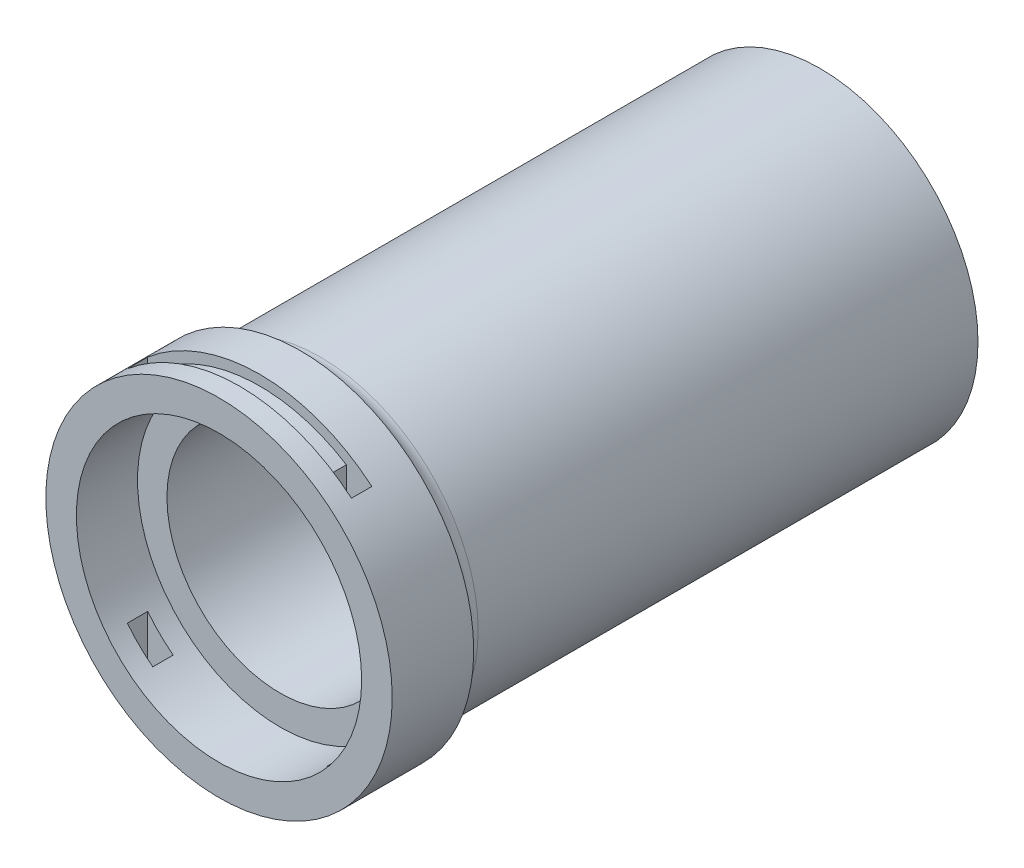
ISO-10303-21;
HEADER;
FILE_DESCRIPTION(('STEP AP214'),'2;1');
FILE_NAME('part.step','',(''),(''),'','','');
FILE_SCHEMA(('AUTOMOTIVE_DESIGN { 1 0 10303 214 1 1 1 1 }'));
ENDSEC;
DATA;
#1=APPLICATION_CONTEXT('core data for automotive mechanical design processes');
#2=APPLICATION_PROTOCOL_DEFINITION('international standard','automotive_design',2000,#1);
#3=PRODUCT_CONTEXT('',#1,'mechanical');
#4=PRODUCT('Part','Part','',(#3));
#5=PRODUCT_RELATED_PRODUCT_CATEGORY('part','',(#4));
#6=PRODUCT_DEFINITION_FORMATION('','',#4);
#7=PRODUCT_DEFINITION_CONTEXT('part definition',#1,'design');
#8=PRODUCT_DEFINITION('design','',#6,#7);
#9=PRODUCT_DEFINITION_SHAPE('','',#8);
#10=(LENGTH_UNIT() NAMED_UNIT(*) SI_UNIT(.MILLI.,.METRE.));
#11=(NAMED_UNIT(*) PLANE_ANGLE_UNIT() SI_UNIT($,.RADIAN.));
#12=(NAMED_UNIT(*) SI_UNIT($,.STERADIAN.) SOLID_ANGLE_UNIT());
#13=UNCERTAINTY_MEASURE_WITH_UNIT(LENGTH_MEASURE(1.E-05),#10,'distance_accuracy_value','');
#14=(GEOMETRIC_REPRESENTATION_CONTEXT(3) GLOBAL_UNCERTAINTY_ASSIGNED_CONTEXT((#13)) GLOBAL_UNIT_ASSIGNED_CONTEXT((#10,
#11,#12)) REPRESENTATION_CONTEXT('',''));
#15=CARTESIAN_POINT('',(0.,0.,0.));
#16=DIRECTION('',(0.,0.,1.));
#17=DIRECTION('',(1.,0.,0.));
#18=AXIS2_PLACEMENT_3D('',#15,#16,#17);
#19=CARTESIAN_POINT('',(0.,0.,0.));
#20=DIRECTION('',(0.,0.,1.));
#21=DIRECTION('',(1.,0.,0.));
#22=AXIS2_PLACEMENT_3D('',#19,#20,#21);
#23=CYLINDRICAL_SURFACE('',#22,5.625);
#24=CARTESIAN_POINT('',(0.,0.,-33.));
#25=DIRECTION('',(0.,0.,-1.));
#26=DIRECTION('',(-1.,0.,0.));
#27=AXIS2_PLACEMENT_3D('',#24,#25,#26);
#28=CIRCLE('',#27,5.625);
#29=CARTESIAN_POINT('',(-5.625,0.,-33.));
#30=VERTEX_POINT('',#29);
#31=EDGE_CURVE('E297',#30,#30,#28,.T.);
#32=ORIENTED_EDGE('',*,*,#31,.T.);
#33=EDGE_LOOP('',(#32));
#34=FACE_BOUND('',#33,.T.);
#35=CARTESIAN_POINT('',(0.,0.,5.99999999999999));
#36=DIRECTION('',(0.,0.,1.));
#37=DIRECTION('',(1.,0.,0.));
#38=AXIS2_PLACEMENT_3D('',#35,#36,#37);
#39=CIRCLE('',#38,5.625);
#40=CARTESIAN_POINT('',(5.625,0.,5.99999999999999));
#41=VERTEX_POINT('',#40);
#42=EDGE_CURVE('E416',#41,#41,#39,.T.);
#43=ORIENTED_EDGE('',*,*,#42,.T.);
#44=EDGE_LOOP('',(#43));
#45=FACE_BOUND('',#44,.T.);
#46=ADVANCED_FACE('F39',(#34,#45),#23,.F.);
#47=CARTESIAN_POINT('',(0.,-10.,26.));
#48=DIRECTION('',(0.,0.,-1.));
#49=DIRECTION('',(-1.,0.,0.));
#50=AXIS2_PLACEMENT_3D('',#47,#48,#49);
#51=CYLINDRICAL_SURFACE('',#50,0.5);
#52=CARTESIAN_POINT('',(1.04744440165294E-13,-10.,-33.));
#53=DIRECTION('',(0.,0.,-1.));
#54=DIRECTION('',(-1.,0.,0.));
#55=AXIS2_PLACEMENT_3D('',#52,#53,#54);
#56=CIRCLE('',#55,0.500000000000001);
#57=CARTESIAN_POINT('',(-0.499999999999896,-10.,-33.));
#58=VERTEX_POINT('',#57);
#59=EDGE_CURVE('E273',#58,#58,#56,.T.);
#60=ORIENTED_EDGE('',*,*,#59,.T.);
#61=EDGE_LOOP('',(#60));
#62=FACE_BOUND('',#61,.T.);
#63=CARTESIAN_POINT('',(0.,-10.,-29.));
#64=DIRECTION('',(0.,0.,1.));
#65=DIRECTION('',(1.,0.,0.));
#66=AXIS2_PLACEMENT_3D('',#63,#64,#65);
#67=CIRCLE('',#66,0.5);
#68=CARTESIAN_POINT('',(0.5,-10.,-29.));
#69=VERTEX_POINT('',#68);
#70=EDGE_CURVE('E274',#69,#69,#67,.T.);
#71=ORIENTED_EDGE('',*,*,#70,.T.);
#72=EDGE_LOOP('',(#71));
#73=FACE_BOUND('',#72,.T.);
#74=ADVANCED_FACE('F361',(#62,#73),#51,.F.);
#75=CARTESIAN_POINT('',(10.,0.,26.));
#76=DIRECTION('',(0.,0.,-1.));
#77=DIRECTION('',(-1.,0.,0.));
#78=AXIS2_PLACEMENT_3D('',#75,#76,#77);
#79=CYLINDRICAL_SURFACE('',#78,0.500000000000001);
#80=CARTESIAN_POINT('',(10.,0.,-33.));
#81=DIRECTION('',(0.,0.,-1.));
#82=DIRECTION('',(-1.,0.,0.));
#83=AXIS2_PLACEMENT_3D('',#80,#81,#82);
#84=CIRCLE('',#83,0.500000000000001);
#85=CARTESIAN_POINT('',(9.5,0.,-33.));
#86=VERTEX_POINT('',#85);
#87=EDGE_CURVE('E294',#86,#86,#84,.T.);
#88=ORIENTED_EDGE('',*,*,#87,.T.);
#89=EDGE_LOOP('',(#88));
#90=FACE_BOUND('',#89,.T.);
#91=CARTESIAN_POINT('',(10.,0.,-29.));
#92=DIRECTION('',(0.,0.,1.));
#93=DIRECTION('',(1.,0.,0.));
#94=AXIS2_PLACEMENT_3D('',#91,#92,#93);
#95=CIRCLE('',#94,0.500000000000001);
#96=CARTESIAN_POINT('',(10.5,0.,-29.));
#97=VERTEX_POINT('',#96);
#98=EDGE_CURVE('E281',#97,#97,#95,.T.);
#99=ORIENTED_EDGE('',*,*,#98,.T.);
#100=EDGE_LOOP('',(#99));
#101=FACE_BOUND('',#100,.T.);
#102=ADVANCED_FACE('F369',(#90,#101),#79,.F.);
#103=CARTESIAN_POINT('',(0.,10.,26.));
#104=DIRECTION('',(0.,0.,-1.));
#105=DIRECTION('',(-1.,0.,0.));
#106=AXIS2_PLACEMENT_3D('',#103,#104,#105);
#107=CYLINDRICAL_SURFACE('',#106,0.5);
#108=CARTESIAN_POINT('',(0.,10.,-33.));
#109=DIRECTION('',(0.,0.,-1.));
#110=DIRECTION('',(-1.,0.,0.));
#111=AXIS2_PLACEMENT_3D('',#108,#109,#110);
#112=CIRCLE('',#111,0.5);
#113=CARTESIAN_POINT('',(-0.500000000000035,10.,-33.));
#114=VERTEX_POINT('',#113);
#115=EDGE_CURVE('E291',#114,#114,#112,.T.);
#116=ORIENTED_EDGE('',*,*,#115,.T.);
#117=EDGE_LOOP('',(#116));
#118=FACE_BOUND('',#117,.T.);
#119=CARTESIAN_POINT('',(0.,10.,-29.));
#120=DIRECTION('',(0.,0.,1.));
#121=DIRECTION('',(1.,0.,0.));
#122=AXIS2_PLACEMENT_3D('',#119,#120,#121);
#123=CIRCLE('',#122,0.5);
#124=CARTESIAN_POINT('',(0.5,10.,-29.));
#125=VERTEX_POINT('',#124);
#126=EDGE_CURVE('E269',#125,#125,#123,.T.);
#127=ORIENTED_EDGE('',*,*,#126,.T.);
#128=EDGE_LOOP('',(#127));
#129=FACE_BOUND('',#128,.T.);
#130=ADVANCED_FACE('F353',(#118,#129),#107,.F.);
#131=CARTESIAN_POINT('',(-10.,0.,26.));
#132=DIRECTION('',(0.,0.,-1.));
#133=DIRECTION('',(-1.,0.,0.));
#134=AXIS2_PLACEMENT_3D('',#131,#132,#133);
#135=CYLINDRICAL_SURFACE('',#134,0.500000000000001);
#136=CARTESIAN_POINT('',(-10.,0.,-33.));
#137=DIRECTION('',(0.,0.,-1.));
#138=DIRECTION('',(-1.,0.,0.));
#139=AXIS2_PLACEMENT_3D('',#136,#137,#138);
#140=CIRCLE('',#139,0.500000000000001);
#141=CARTESIAN_POINT('',(-10.5,0.,-33.));
#142=VERTEX_POINT('',#141);
#143=EDGE_CURVE('E278',#142,#142,#140,.T.);
#144=ORIENTED_EDGE('',*,*,#143,.T.);
#145=EDGE_LOOP('',(#144));
#146=FACE_BOUND('',#145,.T.);
#147=CARTESIAN_POINT('',(-10.,0.,-29.));
#148=DIRECTION('',(0.,0.,1.));
#149=DIRECTION('',(1.,0.,0.));
#150=AXIS2_PLACEMENT_3D('',#147,#148,#149);
#151=CIRCLE('',#150,0.500000000000001);
#152=CARTESIAN_POINT('',(-9.5,0.,-29.));
#153=VERTEX_POINT('',#152);
#154=EDGE_CURVE('E267',#153,#153,#151,.T.);
#155=ORIENTED_EDGE('',*,*,#154,.T.);
#156=EDGE_LOOP('',(#155));
#157=FACE_BOUND('',#156,.T.);
#158=ADVANCED_FACE('F344',(#146,#157),#135,.F.);
#159=CARTESIAN_POINT('',(-8.5,-20.,0.));
#160=DIRECTION('',(1.,0.,0.));
#161=DIRECTION('',(0.,0.,-1.));
#162=AXIS2_PLACEMENT_3D('',#159,#160,#161);
#163=PLANE('',#162);
#164=DIRECTION('',(0.,0.,1.));
#165=VECTOR('',#164,1.);
#166=CARTESIAN_POINT('',(-8.5,13.555441711726,22.));
#167=LINE('',#166,#165);
#168=CARTESIAN_POINT('',(-8.5,13.555441711726,22.));
#169=VERTEX_POINT('',#168);
#170=CARTESIAN_POINT('',(-8.5,13.555441711726,24.));
#171=VERTEX_POINT('',#170);
#172=EDGE_CURVE('E157',#169,#171,#167,.T.);
#173=ORIENTED_EDGE('',*,*,#172,.F.);
#174=DIRECTION('',(0.,1.,0.));
#175=VECTOR('',#174,1.);
#176=CARTESIAN_POINT('',(-8.5,-20.,22.));
#177=LINE('',#176,#175);
#178=CARTESIAN_POINT('',(-8.5,11.1242977306435,22.));
#179=VERTEX_POINT('',#178);
#180=EDGE_CURVE('E203',#179,#169,#177,.T.);
#181=ORIENTED_EDGE('',*,*,#180,.F.);
#182=DIRECTION('',(0.,0.,1.));
#183=VECTOR('',#182,1.);
#184=CARTESIAN_POINT('',(-8.5,11.1242977306435,20.));
#185=LINE('',#184,#183);
#186=CARTESIAN_POINT('',(-8.5,11.1242977306435,24.));
#187=VERTEX_POINT('',#186);
#188=EDGE_CURVE('E245',#187,#179,#185,.F.);
#189=ORIENTED_EDGE('',*,*,#188,.F.);
#190=DIRECTION('',(0.,1.,0.));
#191=VECTOR('',#190,1.);
#192=CARTESIAN_POINT('',(-8.5,-20.,24.));
#193=LINE('',#192,#191);
#194=EDGE_CURVE('E193',#187,#171,#193,.T.);
#195=ORIENTED_EDGE('',*,*,#194,.T.);
#196=EDGE_LOOP('',(#173,#181,#189,#195));
#197=FACE_BOUND('',#196,.T.);
#198=ADVANCED_FACE('F342',(#197),#163,.F.);
#199=CARTESIAN_POINT('',(8.5,-20.,0.));
#200=DIRECTION('',(1.,0.,0.));
#201=DIRECTION('',(0.,0.,-1.));
#202=AXIS2_PLACEMENT_3D('',#199,#200,#201);
#203=PLANE('',#202);
#204=DIRECTION('',(0.,1.,0.));
#205=VECTOR('',#204,1.);
#206=CARTESIAN_POINT('',(8.5,-20.,22.));
#207=LINE('',#206,#205);
#208=CARTESIAN_POINT('',(8.5,11.1242977306435,22.));
#209=VERTEX_POINT('',#208);
#210=CARTESIAN_POINT('',(8.5,13.555441711726,22.));
#211=VERTEX_POINT('',#210);
#212=EDGE_CURVE('E172',#209,#211,#207,.T.);
#213=ORIENTED_EDGE('',*,*,#212,.T.);
#214=DIRECTION('',(0.,0.,1.));
#215=VECTOR('',#214,1.);
#216=CARTESIAN_POINT('',(8.5,13.555441711726,22.));
#217=LINE('',#216,#215);
#218=CARTESIAN_POINT('',(8.5,13.555441711726,24.));
#219=VERTEX_POINT('',#218);
#220=EDGE_CURVE('E47',#211,#219,#217,.T.);
#221=ORIENTED_EDGE('',*,*,#220,.T.);
#222=DIRECTION('',(0.,1.,0.));
#223=VECTOR('',#222,1.);
#224=CARTESIAN_POINT('',(8.5,-20.,24.));
#225=LINE('',#224,#223);
#226=CARTESIAN_POINT('',(8.5,11.1242977306435,24.));
#227=VERTEX_POINT('',#226);
#228=EDGE_CURVE('E169',#227,#219,#225,.T.);
#229=ORIENTED_EDGE('',*,*,#228,.F.);
#230=DIRECTION('',(0.,0.,1.));
#231=VECTOR('',#230,1.);
#232=CARTESIAN_POINT('',(8.5,11.1242977306435,20.));
#233=LINE('',#232,#231);
#234=EDGE_CURVE('E260',#227,#209,#233,.F.);
#235=ORIENTED_EDGE('',*,*,#234,.T.);
#236=EDGE_LOOP('',(#213,#221,#229,#235));
#237=FACE_BOUND('',#236,.T.);
#238=ADVANCED_FACE('F168',(#237),#203,.T.);
#239=CARTESIAN_POINT('',(0.,0.,18.));
#240=DIRECTION('',(0.,0.,1.));
#241=DIRECTION('',(1.,0.,0.));
#242=AXIS2_PLACEMENT_3D('',#239,#240,#241);
#243=CYLINDRICAL_SURFACE('',#242,17.);
#244=CARTESIAN_POINT('',(0.,0.,22.));
#245=DIRECTION('',(0.,0.,1.));
#246=DIRECTION('',(1.,0.,0.));
#247=AXIS2_PLACEMENT_3D('',#244,#245,#246);
#248=CIRCLE('',#247,17.);
#249=CARTESIAN_POINT('',(-11.,12.9614813968157,22.));
#250=VERTEX_POINT('',#249);
#251=CARTESIAN_POINT('',(11.,12.9614813968157,22.));
#252=VERTEX_POINT('',#251);
#253=EDGE_CURVE('E208',#250,#252,#248,.F.);
#254=ORIENTED_EDGE('',*,*,#253,.T.);
#255=DIRECTION('',(0.,0.,1.));
#256=VECTOR('',#255,1.);
#257=CARTESIAN_POINT('',(11.,12.9614813968157,18.));
#258=LINE('',#257,#256);
#259=CARTESIAN_POINT('',(11.,12.9614813968157,24.));
#260=VERTEX_POINT('',#259);
#261=EDGE_CURVE('E187',#252,#260,#258,.T.);
#262=ORIENTED_EDGE('',*,*,#261,.T.);
#263=CARTESIAN_POINT('',(0.,0.,24.));
#264=DIRECTION('',(0.,0.,1.));
#265=DIRECTION('',(1.,0.,0.));
#266=AXIS2_PLACEMENT_3D('',#263,#264,#265);
#267=CIRCLE('',#266,17.);
#268=CARTESIAN_POINT('',(-11.,12.9614813968157,24.));
#269=VERTEX_POINT('',#268);
#270=EDGE_CURVE('E216',#269,#260,#267,.F.);
#271=ORIENTED_EDGE('',*,*,#270,.F.);
#272=DIRECTION('',(0.,0.,1.));
#273=VECTOR('',#272,1.);
#274=CARTESIAN_POINT('',(-11.,12.9614813968157,18.));
#275=LINE('',#274,#273);
#276=EDGE_CURVE('E211',#250,#269,#275,.T.);
#277=ORIENTED_EDGE('',*,*,#276,.F.);
#278=EDGE_LOOP('',(#254,#262,#271,#277));
#279=FACE_BOUND('',#278,.T.);
#280=CARTESIAN_POINT('',(0.,0.,26.));
#281=DIRECTION('',(0.,0.,1.));
#282=DIRECTION('',(1.,0.,0.));
#283=AXIS2_PLACEMENT_3D('',#280,#281,#282);
#284=CIRCLE('',#283,17.);
#285=CARTESIAN_POINT('',(17.,0.,26.));
#286=VERTEX_POINT('',#285);
#287=EDGE_CURVE('E221',#286,#286,#284,.T.);
#288=ORIENTED_EDGE('',*,*,#287,.F.);
#289=EDGE_LOOP('',(#288));
#290=FACE_BOUND('',#289,.T.);
#291=CARTESIAN_POINT('',(0.,0.,18.));
#292=DIRECTION('',(0.,0.,1.));
#293=DIRECTION('',(1.,0.,0.));
#294=AXIS2_PLACEMENT_3D('',#291,#292,#293);
#295=CIRCLE('',#294,17.);
#296=CARTESIAN_POINT('',(17.,0.,18.));
#297=VERTEX_POINT('',#296);
#298=EDGE_CURVE('E227',#297,#297,#295,.T.);
#299=ORIENTED_EDGE('',*,*,#298,.T.);
#300=EDGE_LOOP('',(#299));
#301=FACE_BOUND('',#300,.T.);
#302=DIRECTION('',(0.,0.,1.));
#303=VECTOR('',#302,1.);
#304=CARTESIAN_POINT('',(11.,-12.9614813968157,18.));
#305=LINE('',#304,#303);
#306=CARTESIAN_POINT('',(11.,-12.9614813968157,24.));
#307=VERTEX_POINT('',#306);
#308=CARTESIAN_POINT('',(11.,-12.9614813968157,22.));
#309=VERTEX_POINT('',#308);
#310=EDGE_CURVE('E190',#307,#309,#305,.F.);
#311=ORIENTED_EDGE('',*,*,#310,.T.);
#312=CARTESIAN_POINT('',(-11.,-12.9614813968157,22.));
#313=VERTEX_POINT('',#312);
#314=EDGE_CURVE('E210',#309,#313,#248,.F.);
#315=ORIENTED_EDGE('',*,*,#314,.T.);
#316=DIRECTION('',(0.,0.,1.));
#317=VECTOR('',#316,1.);
#318=CARTESIAN_POINT('',(-11.,-12.9614813968157,18.));
#319=LINE('',#318,#317);
#320=CARTESIAN_POINT('',(-11.,-12.9614813968157,24.));
#321=VERTEX_POINT('',#320);
#322=EDGE_CURVE('E213',#321,#313,#319,.F.);
#323=ORIENTED_EDGE('',*,*,#322,.F.);
#324=EDGE_CURVE('E62',#307,#321,#267,.F.);
#325=ORIENTED_EDGE('',*,*,#324,.F.);
#326=EDGE_LOOP('',(#311,#315,#323,#325));
#327=FACE_BOUND('',#326,.T.);
#328=ADVANCED_FACE('F327',(#279,#290,#301,#327),#243,.T.);
#329=DIRECTION('',(0.,0.,1.));
#330=VECTOR('',#329,1.);
#331=CARTESIAN_POINT('',(-8.5,-13.555441711726,22.));
#332=LINE('',#331,#330);
#333=CARTESIAN_POINT('',(-8.5,-13.555441711726,24.));
#334=VERTEX_POINT('',#333);
#335=CARTESIAN_POINT('',(-8.5,-13.555441711726,22.));
#336=VERTEX_POINT('',#335);
#337=EDGE_CURVE('E179',#334,#336,#332,.F.);
#338=ORIENTED_EDGE('',*,*,#337,.F.);
#339=CARTESIAN_POINT('',(-8.5,-11.1242977306435,24.));
#340=VERTEX_POINT('',#339);
#341=EDGE_CURVE('E206',#334,#340,#193,.T.);
#342=ORIENTED_EDGE('',*,*,#341,.T.);
#343=DIRECTION('',(0.,0.,1.));
#344=VECTOR('',#343,1.);
#345=CARTESIAN_POINT('',(-8.5,-11.1242977306435,20.));
#346=LINE('',#345,#344);
#347=CARTESIAN_POINT('',(-8.5,-11.1242977306435,22.));
#348=VERTEX_POINT('',#347);
#349=EDGE_CURVE('E233',#348,#340,#346,.T.);
#350=ORIENTED_EDGE('',*,*,#349,.F.);
#351=EDGE_CURVE('E202',#336,#348,#177,.T.);
#352=ORIENTED_EDGE('',*,*,#351,.F.);
#353=EDGE_LOOP('',(#338,#342,#350,#352));
#354=FACE_BOUND('',#353,.T.);
#355=ADVANCED_FACE('F346',(#354),#163,.F.);
#356=CARTESIAN_POINT('',(8.5,-13.555441711726,24.));
#357=VERTEX_POINT('',#356);
#358=CARTESIAN_POINT('',(8.5,-11.1242977306435,24.));
#359=VERTEX_POINT('',#358);
#360=EDGE_CURVE('E178',#357,#359,#225,.T.);
#361=ORIENTED_EDGE('',*,*,#360,.F.);
#362=DIRECTION('',(0.,0.,1.));
#363=VECTOR('',#362,1.);
#364=CARTESIAN_POINT('',(8.5,-13.555441711726,22.));
#365=LINE('',#364,#363);
#366=CARTESIAN_POINT('',(8.5,-13.555441711726,22.));
#367=VERTEX_POINT('',#366);
#368=EDGE_CURVE('E182',#357,#367,#365,.F.);
#369=ORIENTED_EDGE('',*,*,#368,.T.);
#370=CARTESIAN_POINT('',(8.5,-11.1242977306435,22.));
#371=VERTEX_POINT('',#370);
#372=EDGE_CURVE('E191',#367,#371,#207,.T.);
#373=ORIENTED_EDGE('',*,*,#372,.T.);
#374=DIRECTION('',(0.,0.,1.));
#375=VECTOR('',#374,1.);
#376=CARTESIAN_POINT('',(8.5,-11.1242977306435,20.));
#377=LINE('',#376,#375);
#378=EDGE_CURVE('E173',#371,#359,#377,.T.);
#379=ORIENTED_EDGE('',*,*,#378,.T.);
#380=EDGE_LOOP('',(#361,#369,#373,#379));
#381=FACE_BOUND('',#380,.T.);
#382=ADVANCED_FACE('F351',(#381),#203,.T.);
#383=CARTESIAN_POINT('',(0.,0.,20.));
#384=DIRECTION('',(0.,0.,1.));
#385=DIRECTION('',(1.,0.,0.));
#386=AXIS2_PLACEMENT_3D('',#383,#384,#385);
#387=CYLINDRICAL_SURFACE('',#386,14.);
#388=ORIENTED_EDGE('',*,*,#234,.F.);
#389=CARTESIAN_POINT('',(0.,0.,24.));
#390=DIRECTION('',(0.,0.,-1.));
#391=DIRECTION('',(-1.,0.,0.));
#392=AXIS2_PLACEMENT_3D('',#389,#390,#391);
#393=CIRCLE('',#392,14.);
#394=CARTESIAN_POINT('',(11.,8.66025403784439,24.));
#395=VERTEX_POINT('',#394);
#396=EDGE_CURVE('E177',#395,#227,#393,.F.);
#397=ORIENTED_EDGE('',*,*,#396,.F.);
#398=DIRECTION('',(0.,0.,1.));
#399=VECTOR('',#398,1.);
#400=CARTESIAN_POINT('',(11.,8.66025403784439,20.));
#401=LINE('',#400,#399);
#402=CARTESIAN_POINT('',(11.,8.66025403784439,22.));
#403=VERTEX_POINT('',#402);
#404=EDGE_CURVE('E253',#403,#395,#401,.T.);
#405=ORIENTED_EDGE('',*,*,#404,.F.);
#406=CARTESIAN_POINT('',(0.,0.,22.));
#407=DIRECTION('',(0.,0.,-1.));
#408=DIRECTION('',(-1.,0.,0.));
#409=AXIS2_PLACEMENT_3D('',#406,#407,#408);
#410=CIRCLE('',#409,14.);
#411=EDGE_CURVE('E257',#403,#209,#410,.F.);
#412=ORIENTED_EDGE('',*,*,#411,.T.);
#413=EDGE_LOOP('',(#388,#397,#405,#412));
#414=FACE_BOUND('',#413,.T.);
#415=DIRECTION('',(0.,0.,1.));
#416=VECTOR('',#415,1.);
#417=CARTESIAN_POINT('',(-11.,8.66025403784438,20.));
#418=LINE('',#417,#416);
#419=CARTESIAN_POINT('',(-11.,8.66025403784438,22.));
#420=VERTEX_POINT('',#419);
#421=CARTESIAN_POINT('',(-11.,8.66025403784438,24.));
#422=VERTEX_POINT('',#421);
#423=EDGE_CURVE('E249',#420,#422,#418,.T.);
#424=ORIENTED_EDGE('',*,*,#423,.T.);
#425=CARTESIAN_POINT('',(0.,0.,24.));
#426=DIRECTION('',(0.,0.,1.));
#427=DIRECTION('',(1.,0.,0.));
#428=AXIS2_PLACEMENT_3D('',#425,#426,#427);
#429=CIRCLE('',#428,14.);
#430=EDGE_CURVE('E246',#422,#187,#429,.F.);
#431=ORIENTED_EDGE('',*,*,#430,.T.);
#432=ORIENTED_EDGE('',*,*,#188,.T.);
#433=CARTESIAN_POINT('',(0.,0.,22.));
#434=DIRECTION('',(0.,0.,1.));
#435=DIRECTION('',(1.,0.,0.));
#436=AXIS2_PLACEMENT_3D('',#433,#434,#435);
#437=CIRCLE('',#436,14.);
#438=EDGE_CURVE('E239',#420,#179,#437,.F.);
#439=ORIENTED_EDGE('',*,*,#438,.F.);
#440=EDGE_LOOP('',(#424,#431,#432,#439));
#441=FACE_BOUND('',#440,.T.);
#442=ORIENTED_EDGE('',*,*,#349,.T.);
#443=CARTESIAN_POINT('',(-11.,-8.66025403784438,24.));
#444=VERTEX_POINT('',#443);
#445=EDGE_CURVE('E242',#340,#444,#429,.F.);
#446=ORIENTED_EDGE('',*,*,#445,.T.);
#447=DIRECTION('',(0.,0.,1.));
#448=VECTOR('',#447,1.);
#449=CARTESIAN_POINT('',(-11.,-8.66025403784438,20.));
#450=LINE('',#449,#448);
#451=CARTESIAN_POINT('',(-11.,-8.66025403784438,22.));
#452=VERTEX_POINT('',#451);
#453=EDGE_CURVE('E238',#444,#452,#450,.F.);
#454=ORIENTED_EDGE('',*,*,#453,.T.);
#455=EDGE_CURVE('E236',#348,#452,#437,.F.);
#456=ORIENTED_EDGE('',*,*,#455,.F.);
#457=EDGE_LOOP('',(#442,#446,#454,#456));
#458=FACE_BOUND('',#457,.T.);
#459=CARTESIAN_POINT('',(0.,0.,20.));
#460=DIRECTION('',(0.,0.,1.));
#461=DIRECTION('',(1.,0.,0.));
#462=AXIS2_PLACEMENT_3D('',#459,#460,#461);
#463=CIRCLE('',#462,14.);
#464=CARTESIAN_POINT('',(14.,0.,20.));
#465=VERTEX_POINT('',#464);
#466=EDGE_CURVE('E218',#465,#465,#463,.T.);
#467=ORIENTED_EDGE('',*,*,#466,.F.);
#468=EDGE_LOOP('',(#467));
#469=FACE_BOUND('',#468,.T.);
#470=CARTESIAN_POINT('',(0.,0.,26.));
#471=DIRECTION('',(0.,0.,1.));
#472=DIRECTION('',(1.,0.,0.));
#473=AXIS2_PLACEMENT_3D('',#470,#471,#472);
#474=CIRCLE('',#473,14.);
#475=CARTESIAN_POINT('',(14.,0.,26.));
#476=VERTEX_POINT('',#475);
#477=EDGE_CURVE('E222',#476,#476,#474,.T.);
#478=ORIENTED_EDGE('',*,*,#477,.T.);
#479=EDGE_LOOP('',(#478));
#480=FACE_BOUND('',#479,.T.);
#481=ORIENTED_EDGE('',*,*,#378,.F.);
#482=CARTESIAN_POINT('',(11.,-8.66025403784439,22.));
#483=VERTEX_POINT('',#482);
#484=EDGE_CURVE('E261',#371,#483,#410,.F.);
#485=ORIENTED_EDGE('',*,*,#484,.T.);
#486=DIRECTION('',(0.,0.,1.));
#487=VECTOR('',#486,1.);
#488=CARTESIAN_POINT('',(11.,-8.66025403784439,20.));
#489=LINE('',#488,#487);
#490=CARTESIAN_POINT('',(11.,-8.66025403784439,24.));
#491=VERTEX_POINT('',#490);
#492=EDGE_CURVE('E263',#491,#483,#489,.F.);
#493=ORIENTED_EDGE('',*,*,#492,.F.);
#494=EDGE_CURVE('E254',#359,#491,#393,.F.);
#495=ORIENTED_EDGE('',*,*,#494,.F.);
#496=EDGE_LOOP('',(#481,#485,#493,#495));
#497=FACE_BOUND('',#496,.T.);
#498=ADVANCED_FACE('F339',(#414,#441,#458,#469,#480,#497),#387,.F.);
#499=CARTESIAN_POINT('',(0.,0.,26.));
#500=DIRECTION('',(0.,0.,1.));
#501=DIRECTION('',(1.,0.,0.));
#502=AXIS2_PLACEMENT_3D('',#499,#500,#501);
#503=PLANE('',#502);
#504=ORIENTED_EDGE('',*,*,#477,.F.);
#505=EDGE_LOOP('',(#504));
#506=FACE_BOUND('',#505,.T.);
#507=ORIENTED_EDGE('',*,*,#287,.T.);
#508=EDGE_LOOP('',(#507));
#509=FACE_BOUND('',#508,.T.);
#510=ADVANCED_FACE('F377',(#506,#509),#503,.T.);
#511=CARTESIAN_POINT('',(0.,0.,26.));
#512=DIRECTION('',(0.,0.,-1.));
#513=DIRECTION('',(-1.,0.,0.));
#514=AXIS2_PLACEMENT_3D('',#511,#512,#513);
#515=CYLINDRICAL_SURFACE('',#514,15.5);
#516=CARTESIAN_POINT('',(0.,0.,16.0635083268963));
#517=DIRECTION('',(0.,0.,1.));
#518=DIRECTION('',(1.,0.,0.));
#519=AXIS2_PLACEMENT_3D('',#516,#517,#518);
#520=CIRCLE('',#519,15.5);
#521=CARTESIAN_POINT('',(15.5,0.,16.0635083268963));
#522=VERTEX_POINT('',#521);
#523=EDGE_CURVE('E230',#522,#522,#520,.F.);
#524=ORIENTED_EDGE('',*,*,#523,.T.);
#525=EDGE_LOOP('',(#524));
#526=FACE_BOUND('',#525,.T.);
#527=CARTESIAN_POINT('',(0.,0.,-33.));
#528=DIRECTION('',(0.,0.,-1.));
#529=DIRECTION('',(-1.,0.,0.));
#530=AXIS2_PLACEMENT_3D('',#527,#528,#529);
#531=CIRCLE('',#530,15.5);
#532=CARTESIAN_POINT('',(-15.5,0.,-33.));
#533=VERTEX_POINT('',#532);
#534=EDGE_CURVE('E163',#533,#533,#531,.T.);
#535=ORIENTED_EDGE('',*,*,#534,.F.);
#536=EDGE_LOOP('',(#535));
#537=FACE_BOUND('',#536,.T.);
#538=ADVANCED_FACE('F379',(#526,#537),#515,.T.);
#539=CARTESIAN_POINT('',(0.,0.,16.0635083268963));
#540=DIRECTION('',(0.,0.,1.));
#541=DIRECTION('',(1.,0.,0.));
#542=AXIS2_PLACEMENT_3D('',#539,#540,#541);
#543=TOROIDAL_SURFACE('',#542,17.5,2.);
#544=ORIENTED_EDGE('',*,*,#523,.F.);
#545=EDGE_LOOP('',(#544));
#546=FACE_BOUND('',#545,.T.);
#547=ORIENTED_EDGE('',*,*,#298,.F.);
#548=EDGE_LOOP('',(#547));
#549=FACE_BOUND('',#548,.T.);
#550=ADVANCED_FACE('F41',(#546,#549),#543,.F.);
#551=CARTESIAN_POINT('',(0.,0.,20.));
#552=DIRECTION('',(0.,0.,1.));
#553=DIRECTION('',(1.,0.,0.));
#554=AXIS2_PLACEMENT_3D('',#551,#552,#553);
#555=PLANE('',#554);
#556=CARTESIAN_POINT('',(0.,0.,20.));
#557=DIRECTION('',(0.,0.,1.));
#558=DIRECTION('',(1.,0.,0.));
#559=AXIS2_PLACEMENT_3D('',#556,#557,#558);
#560=CIRCLE('',#559,11.1125);
#561=CARTESIAN_POINT('',(11.1125,0.,20.));
#562=VERTEX_POINT('',#561);
#563=EDGE_CURVE('E271',#562,#562,#560,.T.);
#564=ORIENTED_EDGE('',*,*,#563,.F.);
#565=EDGE_LOOP('',(#564));
#566=FACE_BOUND('',#565,.T.);
#567=ORIENTED_EDGE('',*,*,#466,.T.);
#568=EDGE_LOOP('',(#567));
#569=FACE_BOUND('',#568,.T.);
#570=ADVANCED_FACE('F386',(#566,#569),#555,.T.);
#571=CARTESIAN_POINT('',(0.,-20.,22.));
#572=DIRECTION('',(0.,0.,1.));
#573=DIRECTION('',(1.,0.,0.));
#574=AXIS2_PLACEMENT_3D('',#571,#572,#573);
#575=PLANE('',#574);
#576=ORIENTED_EDGE('',*,*,#314,.F.);
#577=DIRECTION('',(0.,1.,0.));
#578=VECTOR('',#577,1.);
#579=CARTESIAN_POINT('',(11.,-20.,22.));
#580=LINE('',#579,#578);
#581=EDGE_CURVE('E309',#309,#483,#580,.T.);
#582=ORIENTED_EDGE('',*,*,#581,.T.);
#583=ORIENTED_EDGE('',*,*,#484,.F.);
#584=ORIENTED_EDGE('',*,*,#372,.F.);
#585=CARTESIAN_POINT('',(0.,0.,22.));
#586=DIRECTION('',(0.,0.,1.));
#587=DIRECTION('',(1.,0.,0.));
#588=AXIS2_PLACEMENT_3D('',#585,#586,#587);
#589=CIRCLE('',#588,16.);
#590=EDGE_CURVE('E304',#336,#367,#589,.T.);
#591=ORIENTED_EDGE('',*,*,#590,.F.);
#592=ORIENTED_EDGE('',*,*,#351,.T.);
#593=ORIENTED_EDGE('',*,*,#455,.T.);
#594=DIRECTION('',(0.,1.,0.));
#595=VECTOR('',#594,1.);
#596=CARTESIAN_POINT('',(-11.,-20.,22.));
#597=LINE('',#596,#595);
#598=EDGE_CURVE('E198',#313,#452,#597,.T.);
#599=ORIENTED_EDGE('',*,*,#598,.F.);
#600=EDGE_LOOP('',(#576,#582,#583,#584,#591,#592,#593,#599));
#601=FACE_BOUND('',#600,.T.);
#602=ADVANCED_FACE('F449',(#601),#575,.T.);
#603=CARTESIAN_POINT('',(-11.,-20.,0.));
#604=DIRECTION('',(-1.,0.,0.));
#605=DIRECTION('',(0.,0.,1.));
#606=AXIS2_PLACEMENT_3D('',#603,#604,#605);
#607=PLANE('',#606);
#608=ORIENTED_EDGE('',*,*,#322,.T.);
#609=ORIENTED_EDGE('',*,*,#598,.T.);
#610=ORIENTED_EDGE('',*,*,#453,.F.);
#611=DIRECTION('',(0.,1.,0.));
#612=VECTOR('',#611,1.);
#613=CARTESIAN_POINT('',(-11.,-20.,24.));
#614=LINE('',#613,#612);
#615=EDGE_CURVE('E197',#321,#444,#614,.T.);
#616=ORIENTED_EDGE('',*,*,#615,.F.);
#617=EDGE_LOOP('',(#608,#609,#610,#616));
#618=FACE_BOUND('',#617,.T.);
#619=ADVANCED_FACE('F446',(#618),#607,.F.);
#620=CARTESIAN_POINT('',(0.,-20.,24.));
#621=DIRECTION('',(0.,0.,1.));
#622=DIRECTION('',(1.,0.,0.));
#623=AXIS2_PLACEMENT_3D('',#620,#621,#622);
#624=PLANE('',#623);
#625=ORIENTED_EDGE('',*,*,#341,.F.);
#626=CARTESIAN_POINT('',(0.,0.,24.));
#627=DIRECTION('',(0.,0.,1.));
#628=DIRECTION('',(1.,0.,0.));
#629=AXIS2_PLACEMENT_3D('',#626,#627,#628);
#630=CIRCLE('',#629,16.);
#631=EDGE_CURVE('E54',#334,#357,#630,.T.);
#632=ORIENTED_EDGE('',*,*,#631,.T.);
#633=ORIENTED_EDGE('',*,*,#360,.T.);
#634=ORIENTED_EDGE('',*,*,#494,.T.);
#635=DIRECTION('',(0.,1.,0.));
#636=VECTOR('',#635,1.);
#637=CARTESIAN_POINT('',(11.,-20.,24.));
#638=LINE('',#637,#636);
#639=EDGE_CURVE('E312',#307,#491,#638,.T.);
#640=ORIENTED_EDGE('',*,*,#639,.F.);
#641=ORIENTED_EDGE('',*,*,#324,.T.);
#642=ORIENTED_EDGE('',*,*,#615,.T.);
#643=ORIENTED_EDGE('',*,*,#445,.F.);
#644=EDGE_LOOP('',(#625,#632,#633,#634,#640,#641,#642,#643));
#645=FACE_BOUND('',#644,.T.);
#646=ADVANCED_FACE('F448',(#645),#624,.F.);
#647=ORIENTED_EDGE('',*,*,#270,.T.);
#648=EDGE_CURVE('E181',#395,#260,#638,.T.);
#649=ORIENTED_EDGE('',*,*,#648,.F.);
#650=ORIENTED_EDGE('',*,*,#396,.T.);
#651=ORIENTED_EDGE('',*,*,#228,.T.);
#652=CARTESIAN_POINT('',(0.,0.,24.));
#653=DIRECTION('',(0.,0.,1.));
#654=DIRECTION('',(-1.,0.,0.));
#655=AXIS2_PLACEMENT_3D('',#652,#653,#654);
#656=CIRCLE('',#655,16.);
#657=EDGE_CURVE('E152',#219,#171,#656,.T.);
#658=ORIENTED_EDGE('',*,*,#657,.T.);
#659=ORIENTED_EDGE('',*,*,#194,.F.);
#660=ORIENTED_EDGE('',*,*,#430,.F.);
#661=EDGE_CURVE('E194',#422,#269,#614,.T.);
#662=ORIENTED_EDGE('',*,*,#661,.T.);
#663=EDGE_LOOP('',(#647,#649,#650,#651,#658,#659,#660,#662));
#664=FACE_BOUND('',#663,.T.);
#665=ADVANCED_FACE('F175',(#664),#624,.F.);
#666=ORIENTED_EDGE('',*,*,#276,.T.);
#667=ORIENTED_EDGE('',*,*,#661,.F.);
#668=ORIENTED_EDGE('',*,*,#423,.F.);
#669=EDGE_CURVE('E199',#420,#250,#597,.T.);
#670=ORIENTED_EDGE('',*,*,#669,.T.);
#671=EDGE_LOOP('',(#666,#667,#668,#670));
#672=FACE_BOUND('',#671,.T.);
#673=ADVANCED_FACE('F335',(#672),#607,.F.);
#674=ORIENTED_EDGE('',*,*,#180,.T.);
#675=CARTESIAN_POINT('',(0.,0.,22.));
#676=DIRECTION('',(0.,0.,1.));
#677=DIRECTION('',(-1.,0.,0.));
#678=AXIS2_PLACEMENT_3D('',#675,#676,#677);
#679=CIRCLE('',#678,16.);
#680=EDGE_CURVE('E162',#211,#169,#679,.T.);
#681=ORIENTED_EDGE('',*,*,#680,.F.);
#682=ORIENTED_EDGE('',*,*,#212,.F.);
#683=ORIENTED_EDGE('',*,*,#411,.F.);
#684=EDGE_CURVE('E310',#403,#252,#580,.T.);
#685=ORIENTED_EDGE('',*,*,#684,.T.);
#686=ORIENTED_EDGE('',*,*,#253,.F.);
#687=ORIENTED_EDGE('',*,*,#669,.F.);
#688=ORIENTED_EDGE('',*,*,#438,.T.);
#689=EDGE_LOOP('',(#674,#681,#682,#683,#685,#686,#687,#688));
#690=FACE_BOUND('',#689,.T.);
#691=ADVANCED_FACE('F331',(#690),#575,.T.);
#692=CARTESIAN_POINT('',(11.,-20.,0.));
#693=DIRECTION('',(-1.,0.,0.));
#694=DIRECTION('',(0.,0.,1.));
#695=AXIS2_PLACEMENT_3D('',#692,#693,#694);
#696=PLANE('',#695);
#697=ORIENTED_EDGE('',*,*,#684,.F.);
#698=ORIENTED_EDGE('',*,*,#404,.T.);
#699=ORIENTED_EDGE('',*,*,#648,.T.);
#700=ORIENTED_EDGE('',*,*,#261,.F.);
#701=EDGE_LOOP('',(#697,#698,#699,#700));
#702=FACE_BOUND('',#701,.T.);
#703=ADVANCED_FACE('F323',(#702),#696,.T.);
#704=ORIENTED_EDGE('',*,*,#639,.T.);
#705=ORIENTED_EDGE('',*,*,#492,.T.);
#706=ORIENTED_EDGE('',*,*,#581,.F.);
#707=ORIENTED_EDGE('',*,*,#310,.F.);
#708=EDGE_LOOP('',(#704,#705,#706,#707));
#709=FACE_BOUND('',#708,.T.);
#710=ADVANCED_FACE('F442',(#709),#696,.T.);
#711=CARTESIAN_POINT('',(0.,0.,22.));
#712=DIRECTION('',(0.,0.,1.));
#713=DIRECTION('',(1.,0.,0.));
#714=AXIS2_PLACEMENT_3D('',#711,#712,#713);
#715=CYLINDRICAL_SURFACE('',#714,16.);
#716=ORIENTED_EDGE('',*,*,#337,.T.);
#717=ORIENTED_EDGE('',*,*,#590,.T.);
#718=ORIENTED_EDGE('',*,*,#368,.F.);
#719=ORIENTED_EDGE('',*,*,#631,.F.);
#720=EDGE_LOOP('',(#716,#717,#718,#719));
#721=FACE_BOUND('',#720,.T.);
#722=ADVANCED_FACE('F439',(#721),#715,.T.);
#723=CARTESIAN_POINT('',(0.,0.,22.));
#724=DIRECTION('',(0.,0.,1.));
#725=DIRECTION('',(1.,0.,0.));
#726=AXIS2_PLACEMENT_3D('',#723,#724,#725);
#727=CYLINDRICAL_SURFACE('',#726,16.);
#728=ORIENTED_EDGE('',*,*,#172,.T.);
#729=ORIENTED_EDGE('',*,*,#657,.F.);
#730=ORIENTED_EDGE('',*,*,#220,.F.);
#731=ORIENTED_EDGE('',*,*,#680,.T.);
#732=EDGE_LOOP('',(#728,#729,#730,#731));
#733=FACE_BOUND('',#732,.T.);
#734=ADVANCED_FACE('F154',(#733),#727,.T.);
#735=CARTESIAN_POINT('',(0.,0.,-33.));
#736=DIRECTION('',(0.,0.,-1.));
#737=DIRECTION('',(-1.,0.,0.));
#738=AXIS2_PLACEMENT_3D('',#735,#736,#737);
#739=PLANE('',#738);
#740=ORIENTED_EDGE('',*,*,#143,.F.);
#741=EDGE_LOOP('',(#740));
#742=FACE_BOUND('',#741,.T.);
#743=ORIENTED_EDGE('',*,*,#87,.F.);
#744=EDGE_LOOP('',(#743));
#745=FACE_BOUND('',#744,.T.);
#746=ORIENTED_EDGE('',*,*,#534,.T.);
#747=EDGE_LOOP('',(#746));
#748=FACE_BOUND('',#747,.T.);
#749=ORIENTED_EDGE('',*,*,#31,.F.);
#750=EDGE_LOOP('',(#749));
#751=FACE_BOUND('',#750,.T.);
#752=ORIENTED_EDGE('',*,*,#115,.F.);
#753=EDGE_LOOP('',(#752));
#754=FACE_BOUND('',#753,.T.);
#755=ORIENTED_EDGE('',*,*,#59,.F.);
#756=EDGE_LOOP('',(#755));
#757=FACE_BOUND('',#756,.T.);
#758=ADVANCED_FACE('F392',(#742,#745,#748,#751,#754,#757),#739,.T.);
#759=CARTESIAN_POINT('',(0.,0.,-29.));
#760=DIRECTION('',(0.,0.,1.));
#761=DIRECTION('',(1.,0.,0.));
#762=AXIS2_PLACEMENT_3D('',#759,#760,#761);
#763=PLANE('',#762);
#764=CARTESIAN_POINT('',(0.,0.,-29.));
#765=DIRECTION('',(0.,0.,1.));
#766=DIRECTION('',(1.,0.,0.));
#767=AXIS2_PLACEMENT_3D('',#764,#765,#766);
#768=CIRCLE('',#767,9.);
#769=CARTESIAN_POINT('',(9.,0.,-29.));
#770=VERTEX_POINT('',#769);
#771=EDGE_CURVE('E12',#770,#770,#768,.T.);
#772=ORIENTED_EDGE('',*,*,#771,.F.);
#773=EDGE_LOOP('',(#772));
#774=FACE_BOUND('',#773,.T.);
#775=CARTESIAN_POINT('',(0.,0.,-29.));
#776=DIRECTION('',(0.,0.,1.));
#777=DIRECTION('',(1.,0.,0.));
#778=AXIS2_PLACEMENT_3D('',#775,#776,#777);
#779=CIRCLE('',#778,11.1125);
#780=CARTESIAN_POINT('',(11.1125,0.,-29.));
#781=VERTEX_POINT('',#780);
#782=EDGE_CURVE('E270',#781,#781,#779,.T.);
#783=ORIENTED_EDGE('',*,*,#782,.T.);
#784=EDGE_LOOP('',(#783));
#785=FACE_BOUND('',#784,.T.);
#786=ORIENTED_EDGE('',*,*,#154,.F.);
#787=EDGE_LOOP('',(#786));
#788=FACE_BOUND('',#787,.T.);
#789=ORIENTED_EDGE('',*,*,#126,.F.);
#790=EDGE_LOOP('',(#789));
#791=FACE_BOUND('',#790,.T.);
#792=ORIENTED_EDGE('',*,*,#98,.F.);
#793=EDGE_LOOP('',(#792));
#794=FACE_BOUND('',#793,.T.);
#795=ORIENTED_EDGE('',*,*,#70,.F.);
#796=EDGE_LOOP('',(#795));
#797=FACE_BOUND('',#796,.T.);
#798=ADVANCED_FACE('F395',(#774,#785,#788,#791,#794,#797),#763,.T.);
#799=CARTESIAN_POINT('',(0.,0.,54.));
#800=DIRECTION('',(0.,0.,-1.));
#801=DIRECTION('',(-1.,0.,0.));
#802=AXIS2_PLACEMENT_3D('',#799,#800,#801);
#803=CYLINDRICAL_SURFACE('',#802,11.1125);
#804=ORIENTED_EDGE('',*,*,#782,.F.);
#805=EDGE_LOOP('',(#804));
#806=FACE_BOUND('',#805,.T.);
#807=ORIENTED_EDGE('',*,*,#563,.T.);
#808=EDGE_LOOP('',(#807));
#809=FACE_BOUND('',#808,.T.);
#810=ADVANCED_FACE('F375',(#806,#809),#803,.F.);
#811=CARTESIAN_POINT('',(0.,0.,-29.));
#812=DIRECTION('',(0.,0.,1.));
#813=DIRECTION('',(1.,0.,0.));
#814=AXIS2_PLACEMENT_3D('',#811,#812,#813);
#815=CYLINDRICAL_SURFACE('',#814,9.);
#816=ORIENTED_EDGE('',*,*,#771,.T.);
#817=EDGE_LOOP('',(#816));
#818=FACE_BOUND('',#817,.T.);
#819=CARTESIAN_POINT('',(0.,0.,5.99999999999999));
#820=DIRECTION('',(0.,0.,1.));
#821=DIRECTION('',(1.,0.,0.));
#822=AXIS2_PLACEMENT_3D('',#819,#820,#821);
#823=CIRCLE('',#822,9.);
#824=CARTESIAN_POINT('',(9.,0.,5.99999999999999));
#825=VERTEX_POINT('',#824);
#826=EDGE_CURVE('E413',#825,#825,#823,.T.);
#827=ORIENTED_EDGE('',*,*,#826,.F.);
#828=EDGE_LOOP('',(#827));
#829=FACE_BOUND('',#828,.T.);
#830=ADVANCED_FACE('F423',(#818,#829),#815,.T.);
#831=CARTESIAN_POINT('',(0.,0.,5.99999999999999));
#832=DIRECTION('',(0.,0.,1.));
#833=DIRECTION('',(1.,0.,0.));
#834=AXIS2_PLACEMENT_3D('',#831,#832,#833);
#835=PLANE('',#834);
#836=ORIENTED_EDGE('',*,*,#42,.F.);
#837=EDGE_LOOP('',(#836));
#838=FACE_BOUND('',#837,.T.);
#839=ORIENTED_EDGE('',*,*,#826,.T.);
#840=EDGE_LOOP('',(#839));
#841=FACE_BOUND('',#840,.T.);
#842=ADVANCED_FACE('F420',(#838,#841),#835,.T.);
#843=CLOSED_SHELL('',(#46,#74,#102,#130,#158,#198,#238,#328,#355,#382,#498,#510,#538,#550,#570,
#602,#619,#646,#665,#673,#691,#703,#710,#722,#734,#758,#798,#810,#830,#842));
#844=MANIFOLD_SOLID_BREP('B2',#843);
#845=ADVANCED_BREP_SHAPE_REPRESENTATION('',(#18,#844),#14);
#846=SHAPE_DEFINITION_REPRESENTATION(#9,#845);
ENDSEC;
END-ISO-10303-21;
